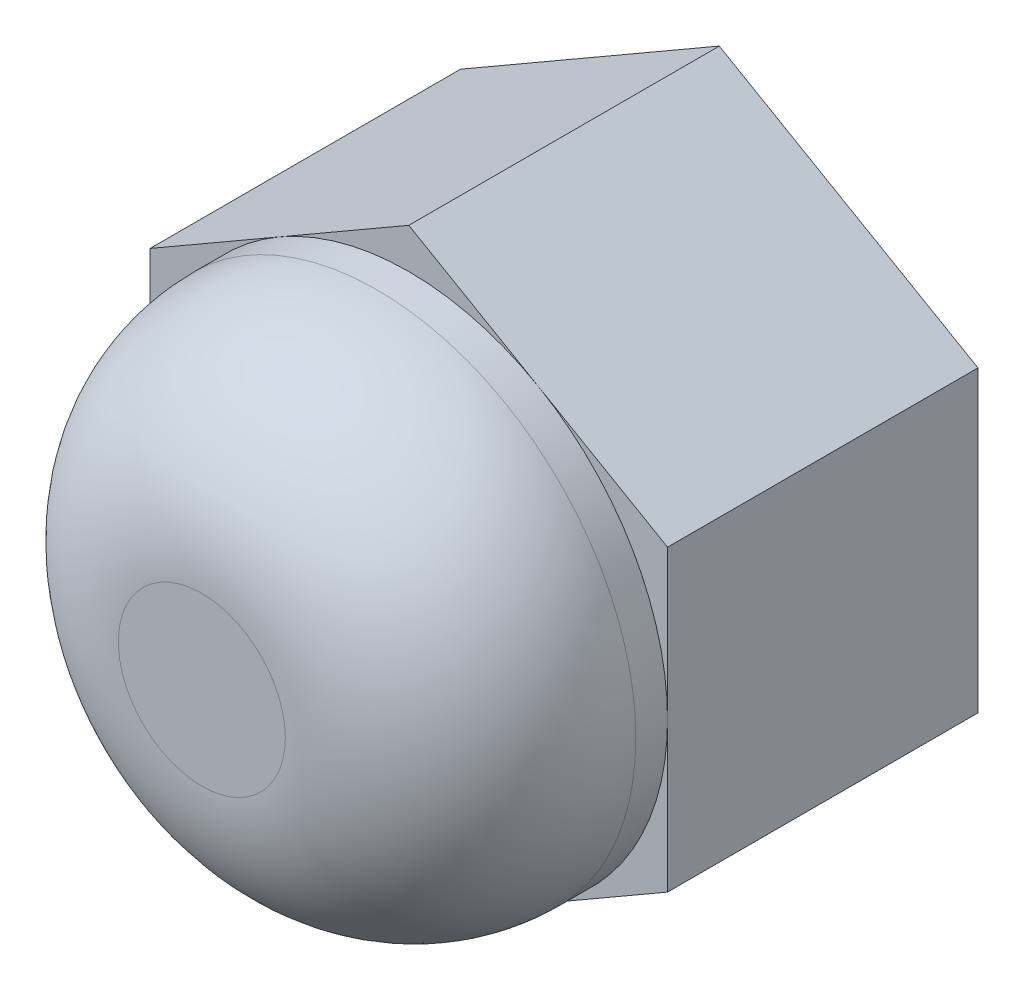
ISO-10303-21;
HEADER;
FILE_DESCRIPTION(('STEP AP214'),'2;1');
FILE_NAME('part.step','',(''),(''),'','','');
FILE_SCHEMA(('AUTOMOTIVE_DESIGN { 1 0 10303 214 1 1 1 1 }'));
ENDSEC;
DATA;
#1=APPLICATION_CONTEXT('core data for automotive mechanical design processes');
#2=APPLICATION_PROTOCOL_DEFINITION('international standard','automotive_design',2000,#1);
#3=PRODUCT_CONTEXT('',#1,'mechanical');
#4=PRODUCT('Part','Part','',(#3));
#5=PRODUCT_RELATED_PRODUCT_CATEGORY('part','',(#4));
#6=PRODUCT_DEFINITION_FORMATION('','',#4);
#7=PRODUCT_DEFINITION_CONTEXT('part definition',#1,'design');
#8=PRODUCT_DEFINITION('design','',#6,#7);
#9=PRODUCT_DEFINITION_SHAPE('','',#8);
#10=(LENGTH_UNIT() NAMED_UNIT(*) SI_UNIT(.MILLI.,.METRE.));
#11=(NAMED_UNIT(*) PLANE_ANGLE_UNIT() SI_UNIT($,.RADIAN.));
#12=(NAMED_UNIT(*) SI_UNIT($,.STERADIAN.) SOLID_ANGLE_UNIT());
#13=UNCERTAINTY_MEASURE_WITH_UNIT(LENGTH_MEASURE(1.E-05),#10,'distance_accuracy_value','');
#14=(GEOMETRIC_REPRESENTATION_CONTEXT(3) GLOBAL_UNCERTAINTY_ASSIGNED_CONTEXT((#13)) GLOBAL_UNIT_ASSIGNED_CONTEXT((#10,
#11,#12)) REPRESENTATION_CONTEXT('',''));
#15=CARTESIAN_POINT('',(0.,0.,0.));
#16=DIRECTION('',(0.,0.,1.));
#17=DIRECTION('',(1.,0.,0.));
#18=AXIS2_PLACEMENT_3D('',#15,#16,#17);
#19=CARTESIAN_POINT('',(0.,0.,9.));
#20=DIRECTION('',(0.,0.,1.));
#21=DIRECTION('',(1.,0.,0.));
#22=AXIS2_PLACEMENT_3D('',#19,#20,#21);
#23=PLANE('',#22);
#24=CARTESIAN_POINT('',(0.,0.,9.));
#25=DIRECTION('',(0.,0.,1.));
#26=DIRECTION('',(1.,0.,0.));
#27=AXIS2_PLACEMENT_3D('',#24,#25,#26);
#28=CIRCLE('',#27,7.5);
#29=CARTESIAN_POINT('',(7.5,0.,9.));
#30=VERTEX_POINT('',#29);
#31=CARTESIAN_POINT('',(3.75,6.49519052838329,9.));
#32=VERTEX_POINT('',#31);
#33=EDGE_CURVE('E145',#30,#32,#28,.T.);
#34=ORIENTED_EDGE('',*,*,#33,.F.);
#35=DIRECTION('',(0.,1.,0.));
#36=VECTOR('',#35,1.);
#37=CARTESIAN_POINT('',(7.5,0.,9.));
#38=LINE('',#37,#36);
#39=CARTESIAN_POINT('',(7.50000000000001,4.33012701892219,9.));
#40=VERTEX_POINT('',#39);
#41=EDGE_CURVE('E132',#30,#40,#38,.T.);
#42=ORIENTED_EDGE('',*,*,#41,.T.);
#43=DIRECTION('',(-0.866025403784439,0.5,0.));
#44=VECTOR('',#43,1.);
#45=CARTESIAN_POINT('',(3.75,6.49519052838329,9.));
#46=LINE('',#45,#44);
#47=EDGE_CURVE('E146',#40,#32,#46,.T.);
#48=ORIENTED_EDGE('',*,*,#47,.T.);
#49=EDGE_LOOP('',(#34,#42,#48));
#50=FACE_BOUND('',#49,.T.);
#51=ADVANCED_FACE('F47',(#50),#23,.T.);
#52=CARTESIAN_POINT('',(-3.75,6.49519052838329,9.));
#53=VERTEX_POINT('',#52);
#54=EDGE_CURVE('E152',#32,#53,#28,.T.);
#55=ORIENTED_EDGE('',*,*,#54,.F.);
#56=CARTESIAN_POINT('',(0.,8.66025403784439,9.));
#57=VERTEX_POINT('',#56);
#58=EDGE_CURVE('E131',#32,#57,#46,.T.);
#59=ORIENTED_EDGE('',*,*,#58,.T.);
#60=DIRECTION('',(-0.866025403784439,-0.5,0.));
#61=VECTOR('',#60,1.);
#62=CARTESIAN_POINT('',(-3.75,6.49519052838329,9.));
#63=LINE('',#62,#61);
#64=EDGE_CURVE('E174',#57,#53,#63,.T.);
#65=ORIENTED_EDGE('',*,*,#64,.T.);
#66=EDGE_LOOP('',(#55,#59,#65));
#67=FACE_BOUND('',#66,.T.);
#68=ADVANCED_FACE('F245',(#67),#23,.T.);
#69=CARTESIAN_POINT('',(-7.5,0.,9.));
#70=VERTEX_POINT('',#69);
#71=EDGE_CURVE('E71',#53,#70,#28,.T.);
#72=ORIENTED_EDGE('',*,*,#71,.F.);
#73=CARTESIAN_POINT('',(-7.5,4.33012701892219,9.));
#74=VERTEX_POINT('',#73);
#75=EDGE_CURVE('E173',#53,#74,#63,.T.);
#76=ORIENTED_EDGE('',*,*,#75,.T.);
#77=DIRECTION('',(0.,-1.,0.));
#78=VECTOR('',#77,1.);
#79=CARTESIAN_POINT('',(-7.5,0.,9.));
#80=LINE('',#79,#78);
#81=EDGE_CURVE('E179',#74,#70,#80,.T.);
#82=ORIENTED_EDGE('',*,*,#81,.T.);
#83=EDGE_LOOP('',(#72,#76,#82));
#84=FACE_BOUND('',#83,.T.);
#85=ADVANCED_FACE('F250',(#84),#23,.T.);
#86=CARTESIAN_POINT('',(-3.75,-6.49519052838329,9.));
#87=VERTEX_POINT('',#86);
#88=EDGE_CURVE('E63',#70,#87,#28,.T.);
#89=ORIENTED_EDGE('',*,*,#88,.F.);
#90=CARTESIAN_POINT('',(-7.50000000000001,-4.33012701892219,9.));
#91=VERTEX_POINT('',#90);
#92=EDGE_CURVE('E178',#70,#91,#80,.T.);
#93=ORIENTED_EDGE('',*,*,#92,.T.);
#94=DIRECTION('',(0.866025403784438,-0.5,0.));
#95=VECTOR('',#94,1.);
#96=CARTESIAN_POINT('',(-3.75,-6.49519052838329,9.));
#97=LINE('',#96,#95);
#98=EDGE_CURVE('E164',#91,#87,#97,.T.);
#99=ORIENTED_EDGE('',*,*,#98,.T.);
#100=EDGE_LOOP('',(#89,#93,#99));
#101=FACE_BOUND('',#100,.T.);
#102=ADVANCED_FACE('F268',(#101),#23,.T.);
#103=CARTESIAN_POINT('',(3.75,-6.49519052838329,9.));
#104=VERTEX_POINT('',#103);
#105=EDGE_CURVE('E155',#87,#104,#28,.T.);
#106=ORIENTED_EDGE('',*,*,#105,.F.);
#107=CARTESIAN_POINT('',(0.,-8.66025403784439,9.));
#108=VERTEX_POINT('',#107);
#109=EDGE_CURVE('E167',#87,#108,#97,.T.);
#110=ORIENTED_EDGE('',*,*,#109,.T.);
#111=DIRECTION('',(0.866025403784439,0.5,0.));
#112=VECTOR('',#111,1.);
#113=CARTESIAN_POINT('',(3.75,-6.49519052838329,9.));
#114=LINE('',#113,#112);
#115=EDGE_CURVE('E143',#108,#104,#114,.T.);
#116=ORIENTED_EDGE('',*,*,#115,.T.);
#117=EDGE_LOOP('',(#106,#110,#116));
#118=FACE_BOUND('',#117,.T.);
#119=ADVANCED_FACE('F256',(#118),#23,.T.);
#120=CARTESIAN_POINT('',(-3.75,-6.49519052838329,9.));
#121=DIRECTION('',(0.5,0.866025403784438,0.));
#122=DIRECTION('',(-0.866025403784439,0.5,0.));
#123=AXIS2_PLACEMENT_3D('',#120,#121,#122);
#124=PLANE('',#123);
#125=DIRECTION('',(0.866025403784438,-0.5,0.));
#126=VECTOR('',#125,1.);
#127=CARTESIAN_POINT('',(-3.75,-6.49519052838329,0.));
#128=LINE('',#127,#126);
#129=CARTESIAN_POINT('',(-7.50000000000001,-4.33012701892219,0.));
#130=VERTEX_POINT('',#129);
#131=CARTESIAN_POINT('',(0.,-8.66025403784439,0.));
#132=VERTEX_POINT('',#131);
#133=EDGE_CURVE('E186',#130,#132,#128,.T.);
#134=ORIENTED_EDGE('',*,*,#133,.T.);
#135=DIRECTION('',(0.,0.,-1.));
#136=VECTOR('',#135,1.);
#137=CARTESIAN_POINT('',(0.,-8.66025403784439,9.));
#138=LINE('',#137,#136);
#139=EDGE_CURVE('E157',#108,#132,#138,.T.);
#140=ORIENTED_EDGE('',*,*,#139,.F.);
#141=ORIENTED_EDGE('',*,*,#109,.F.);
#142=ORIENTED_EDGE('',*,*,#98,.F.);
#143=DIRECTION('',(0.,0.,-1.));
#144=VECTOR('',#143,1.);
#145=CARTESIAN_POINT('',(-7.50000000000001,-4.33012701892219,9.));
#146=LINE('',#145,#144);
#147=EDGE_CURVE('E182',#91,#130,#146,.T.);
#148=ORIENTED_EDGE('',*,*,#147,.T.);
#149=EDGE_LOOP('',(#134,#140,#141,#142,#148));
#150=FACE_BOUND('',#149,.T.);
#151=ADVANCED_FACE('F267',(#150),#124,.F.);
#152=CARTESIAN_POINT('',(3.75,-6.49519052838329,9.));
#153=DIRECTION('',(-0.5,0.866025403784439,0.));
#154=DIRECTION('',(-0.866025403784439,-0.5,0.));
#155=AXIS2_PLACEMENT_3D('',#152,#153,#154);
#156=PLANE('',#155);
#157=DIRECTION('',(0.866025403784439,0.5,0.));
#158=VECTOR('',#157,1.);
#159=CARTESIAN_POINT('',(3.75,-6.49519052838329,0.));
#160=LINE('',#159,#158);
#161=CARTESIAN_POINT('',(7.5,-4.3301270189222,0.));
#162=VERTEX_POINT('',#161);
#163=EDGE_CURVE('E190',#132,#162,#160,.T.);
#164=ORIENTED_EDGE('',*,*,#163,.T.);
#165=DIRECTION('',(0.,0.,-1.));
#166=VECTOR('',#165,1.);
#167=CARTESIAN_POINT('',(7.5,-4.3301270189222,9.));
#168=LINE('',#167,#166);
#169=CARTESIAN_POINT('',(7.5,-4.3301270189222,9.));
#170=VERTEX_POINT('',#169);
#171=EDGE_CURVE('E161',#170,#162,#168,.T.);
#172=ORIENTED_EDGE('',*,*,#171,.F.);
#173=EDGE_CURVE('E126',#104,#170,#114,.T.);
#174=ORIENTED_EDGE('',*,*,#173,.F.);
#175=ORIENTED_EDGE('',*,*,#115,.F.);
#176=ORIENTED_EDGE('',*,*,#139,.T.);
#177=EDGE_LOOP('',(#164,#172,#174,#175,#176));
#178=FACE_BOUND('',#177,.T.);
#179=ADVANCED_FACE('F274',(#178),#156,.F.);
#180=CARTESIAN_POINT('',(7.5,0.,9.));
#181=DIRECTION('',(-1.,0.,0.));
#182=DIRECTION('',(0.,-1.,0.));
#183=AXIS2_PLACEMENT_3D('',#180,#181,#182);
#184=PLANE('',#183);
#185=DIRECTION('',(0.,1.,0.));
#186=VECTOR('',#185,1.);
#187=CARTESIAN_POINT('',(7.5,0.,0.));
#188=LINE('',#187,#186);
#189=CARTESIAN_POINT('',(7.50000000000001,4.33012701892219,0.));
#190=VERTEX_POINT('',#189);
#191=EDGE_CURVE('E193',#162,#190,#188,.T.);
#192=ORIENTED_EDGE('',*,*,#191,.T.);
#193=DIRECTION('',(0.,0.,-1.));
#194=VECTOR('',#193,1.);
#195=CARTESIAN_POINT('',(7.50000000000001,4.33012701892219,9.));
#196=LINE('',#195,#194);
#197=EDGE_CURVE('E138',#40,#190,#196,.T.);
#198=ORIENTED_EDGE('',*,*,#197,.F.);
#199=ORIENTED_EDGE('',*,*,#41,.F.);
#200=EDGE_CURVE('E120',#170,#30,#38,.T.);
#201=ORIENTED_EDGE('',*,*,#200,.F.);
#202=ORIENTED_EDGE('',*,*,#171,.T.);
#203=EDGE_LOOP('',(#192,#198,#199,#201,#202));
#204=FACE_BOUND('',#203,.T.);
#205=ADVANCED_FACE('F136',(#204),#184,.F.);
#206=CARTESIAN_POINT('',(3.75,6.49519052838329,9.));
#207=DIRECTION('',(-0.5,-0.866025403784439,0.));
#208=DIRECTION('',(0.866025403784439,-0.5,0.));
#209=AXIS2_PLACEMENT_3D('',#206,#207,#208);
#210=PLANE('',#209);
#211=DIRECTION('',(-0.866025403784439,0.5,0.));
#212=VECTOR('',#211,1.);
#213=CARTESIAN_POINT('',(3.75,6.49519052838329,0.));
#214=LINE('',#213,#212);
#215=CARTESIAN_POINT('',(0.,8.66025403784439,0.));
#216=VERTEX_POINT('',#215);
#217=EDGE_CURVE('E196',#190,#216,#214,.T.);
#218=ORIENTED_EDGE('',*,*,#217,.T.);
#219=DIRECTION('',(0.,0.,-1.));
#220=VECTOR('',#219,1.);
#221=CARTESIAN_POINT('',(0.,8.66025403784439,9.));
#222=LINE('',#221,#220);
#223=EDGE_CURVE('E212',#57,#216,#222,.T.);
#224=ORIENTED_EDGE('',*,*,#223,.F.);
#225=ORIENTED_EDGE('',*,*,#58,.F.);
#226=ORIENTED_EDGE('',*,*,#47,.F.);
#227=ORIENTED_EDGE('',*,*,#197,.T.);
#228=EDGE_LOOP('',(#218,#224,#225,#226,#227));
#229=FACE_BOUND('',#228,.T.);
#230=ADVANCED_FACE('F290',(#229),#210,.F.);
#231=CARTESIAN_POINT('',(-3.75,6.49519052838329,9.));
#232=DIRECTION('',(0.5,-0.866025403784439,0.));
#233=DIRECTION('',(0.866025403784439,0.5,0.));
#234=AXIS2_PLACEMENT_3D('',#231,#232,#233);
#235=PLANE('',#234);
#236=DIRECTION('',(-0.866025403784439,-0.5,0.));
#237=VECTOR('',#236,1.);
#238=CARTESIAN_POINT('',(-3.75,6.49519052838329,0.));
#239=LINE('',#238,#237);
#240=CARTESIAN_POINT('',(-7.5,4.33012701892219,0.));
#241=VERTEX_POINT('',#240);
#242=EDGE_CURVE('E199',#216,#241,#239,.T.);
#243=ORIENTED_EDGE('',*,*,#242,.T.);
#244=DIRECTION('',(0.,0.,-1.));
#245=VECTOR('',#244,1.);
#246=CARTESIAN_POINT('',(-7.5,4.33012701892219,9.));
#247=LINE('',#246,#245);
#248=EDGE_CURVE('E208',#74,#241,#247,.T.);
#249=ORIENTED_EDGE('',*,*,#248,.F.);
#250=ORIENTED_EDGE('',*,*,#75,.F.);
#251=ORIENTED_EDGE('',*,*,#64,.F.);
#252=ORIENTED_EDGE('',*,*,#223,.T.);
#253=EDGE_LOOP('',(#243,#249,#250,#251,#252));
#254=FACE_BOUND('',#253,.T.);
#255=ADVANCED_FACE('F298',(#254),#235,.F.);
#256=CARTESIAN_POINT('',(-7.5,0.,9.));
#257=DIRECTION('',(1.,0.,0.));
#258=DIRECTION('',(0.,1.,0.));
#259=AXIS2_PLACEMENT_3D('',#256,#257,#258);
#260=PLANE('',#259);
#261=DIRECTION('',(0.,-1.,0.));
#262=VECTOR('',#261,1.);
#263=CARTESIAN_POINT('',(-7.5,0.,0.));
#264=LINE('',#263,#262);
#265=EDGE_CURVE('E202',#241,#130,#264,.T.);
#266=ORIENTED_EDGE('',*,*,#265,.T.);
#267=ORIENTED_EDGE('',*,*,#147,.F.);
#268=ORIENTED_EDGE('',*,*,#92,.F.);
#269=ORIENTED_EDGE('',*,*,#81,.F.);
#270=ORIENTED_EDGE('',*,*,#248,.T.);
#271=EDGE_LOOP('',(#266,#267,#268,#269,#270));
#272=FACE_BOUND('',#271,.T.);
#273=ADVANCED_FACE('F263',(#272),#260,.F.);
#274=CARTESIAN_POINT('',(0.,0.,9.));
#275=DIRECTION('',(0.,0.,-1.));
#276=DIRECTION('',(-1.,0.,0.));
#277=AXIS2_PLACEMENT_3D('',#274,#275,#276);
#278=CYLINDRICAL_SURFACE('',#277,3.9);
#279=CARTESIAN_POINT('',(0.,0.,0.254000000000001));
#280=DIRECTION('',(0.,0.,1.));
#281=DIRECTION('',(1.,0.,0.));
#282=AXIS2_PLACEMENT_3D('',#279,#280,#281);
#283=CIRCLE('',#282,3.9);
#284=CARTESIAN_POINT('',(3.9,0.,0.254000000000001));
#285=VERTEX_POINT('',#284);
#286=EDGE_CURVE('E11',#285,#285,#283,.F.);
#287=ORIENTED_EDGE('',*,*,#286,.T.);
#288=EDGE_LOOP('',(#287));
#289=FACE_BOUND('',#288,.T.);
#290=CARTESIAN_POINT('',(0.,0.,9.));
#291=DIRECTION('',(0.,0.,1.));
#292=DIRECTION('',(1.,0.,0.));
#293=AXIS2_PLACEMENT_3D('',#290,#291,#292);
#294=CIRCLE('',#293,3.9);
#295=CARTESIAN_POINT('',(3.9,0.,9.));
#296=VERTEX_POINT('',#295);
#297=EDGE_CURVE('E150',#296,#296,#294,.T.);
#298=ORIENTED_EDGE('',*,*,#297,.T.);
#299=EDGE_LOOP('',(#298));
#300=FACE_BOUND('',#299,.T.);
#301=ADVANCED_FACE('F255',(#289,#300),#278,.F.);
#302=EDGE_CURVE('E124',#104,#30,#28,.T.);
#303=ORIENTED_EDGE('',*,*,#302,.F.);
#304=ORIENTED_EDGE('',*,*,#173,.T.);
#305=ORIENTED_EDGE('',*,*,#200,.T.);
#306=EDGE_LOOP('',(#303,#304,#305));
#307=FACE_BOUND('',#306,.T.);
#308=ADVANCED_FACE('F122',(#307),#23,.T.);
#309=CARTESIAN_POINT('',(0.,0.,0.));
#310=DIRECTION('',(0.,0.,1.));
#311=DIRECTION('',(1.,0.,0.));
#312=AXIS2_PLACEMENT_3D('',#309,#310,#311);
#313=PLANE('',#312);
#314=CARTESIAN_POINT('',(0.,0.,0.));
#315=DIRECTION('',(0.,0.,1.));
#316=DIRECTION('',(1.,0.,0.));
#317=AXIS2_PLACEMENT_3D('',#314,#315,#316);
#318=CIRCLE('',#317,4.154);
#319=CARTESIAN_POINT('',(4.154,0.,0.));
#320=VERTEX_POINT('',#319);
#321=EDGE_CURVE('E56',#320,#320,#318,.T.);
#322=ORIENTED_EDGE('',*,*,#321,.T.);
#323=EDGE_LOOP('',(#322));
#324=FACE_BOUND('',#323,.T.);
#325=ORIENTED_EDGE('',*,*,#133,.F.);
#326=ORIENTED_EDGE('',*,*,#265,.F.);
#327=ORIENTED_EDGE('',*,*,#242,.F.);
#328=ORIENTED_EDGE('',*,*,#217,.F.);
#329=ORIENTED_EDGE('',*,*,#191,.F.);
#330=ORIENTED_EDGE('',*,*,#163,.F.);
#331=EDGE_LOOP('',(#325,#326,#327,#328,#329,#330));
#332=FACE_BOUND('',#331,.T.);
#333=ADVANCED_FACE('F231',(#324,#332),#313,.F.);
#334=CARTESIAN_POINT('',(0.,0.,15.));
#335=DIRECTION('',(0.,0.,1.));
#336=DIRECTION('',(1.,0.,0.));
#337=AXIS2_PLACEMENT_3D('',#334,#335,#336);
#338=PLANE('',#337);
#339=CARTESIAN_POINT('',(0.,0.,15.));
#340=DIRECTION('',(0.,0.,1.));
#341=DIRECTION('',(1.,0.,0.));
#342=AXIS2_PLACEMENT_3D('',#339,#340,#341);
#343=CIRCLE('',#342,2.42);
#344=CARTESIAN_POINT('',(2.42,0.,15.));
#345=VERTEX_POINT('',#344);
#346=EDGE_CURVE('E220',#345,#345,#343,.T.);
#347=ORIENTED_EDGE('',*,*,#346,.T.);
#348=EDGE_LOOP('',(#347));
#349=FACE_BOUND('',#348,.T.);
#350=ADVANCED_FACE('F261',(#349),#338,.T.);
#351=CARTESIAN_POINT('',(0.,0.,15.));
#352=DIRECTION('',(0.,0.,-1.));
#353=DIRECTION('',(-1.,0.,0.));
#354=AXIS2_PLACEMENT_3D('',#351,#352,#353);
#355=CYLINDRICAL_SURFACE('',#354,7.5);
#356=CARTESIAN_POINT('',(0.,0.,9.92));
#357=DIRECTION('',(0.,0.,1.));
#358=DIRECTION('',(1.,0.,0.));
#359=AXIS2_PLACEMENT_3D('',#356,#357,#358);
#360=CIRCLE('',#359,7.5);
#361=CARTESIAN_POINT('',(7.5,0.,9.92));
#362=VERTEX_POINT('',#361);
#363=EDGE_CURVE('E224',#362,#362,#360,.F.);
#364=ORIENTED_EDGE('',*,*,#363,.T.);
#365=EDGE_LOOP('',(#364));
#366=FACE_BOUND('',#365,.T.);
#367=ORIENTED_EDGE('',*,*,#33,.T.);
#368=ORIENTED_EDGE('',*,*,#54,.T.);
#369=ORIENTED_EDGE('',*,*,#71,.T.);
#370=ORIENTED_EDGE('',*,*,#88,.T.);
#371=ORIENTED_EDGE('',*,*,#105,.T.);
#372=ORIENTED_EDGE('',*,*,#302,.T.);
#373=EDGE_LOOP('',(#367,#368,#369,#370,#371,#372));
#374=FACE_BOUND('',#373,.T.);
#375=ADVANCED_FACE('F154',(#366,#374),#355,.T.);
#376=CARTESIAN_POINT('',(0.,0.,9.));
#377=DIRECTION('',(0.,0.,1.));
#378=DIRECTION('',(1.,0.,0.));
#379=AXIS2_PLACEMENT_3D('',#376,#377,#378);
#380=PLANE('',#379);
#381=ORIENTED_EDGE('',*,*,#297,.F.);
#382=EDGE_LOOP('',(#381));
#383=FACE_BOUND('',#382,.T.);
#384=ADVANCED_FACE('F241',(#383),#380,.F.);
#385=CARTESIAN_POINT('',(0.,0.,9.92));
#386=DIRECTION('',(0.,0.,1.));
#387=DIRECTION('',(1.,0.,0.));
#388=AXIS2_PLACEMENT_3D('',#385,#386,#387);
#389=DEGENERATE_TOROIDAL_SURFACE('',#388,2.42,5.08,.T.);
#390=ORIENTED_EDGE('',*,*,#363,.F.);
#391=EDGE_LOOP('',(#390));
#392=FACE_BOUND('',#391,.T.);
#393=ORIENTED_EDGE('',*,*,#346,.F.);
#394=EDGE_LOOP('',(#393));
#395=FACE_BOUND('',#394,.T.);
#396=ADVANCED_FACE('F235',(#392,#395),#389,.T.);
#397=CARTESIAN_POINT('',(0.,0.,0.254000000000001));
#398=DIRECTION('',(0.,0.,1.));
#399=DIRECTION('',(1.,0.,0.));
#400=AXIS2_PLACEMENT_3D('',#397,#398,#399);
#401=TOROIDAL_SURFACE('',#400,4.154,0.254);
#402=ORIENTED_EDGE('',*,*,#286,.F.);
#403=EDGE_LOOP('',(#402));
#404=FACE_BOUND('',#403,.T.);
#405=ORIENTED_EDGE('',*,*,#321,.F.);
#406=EDGE_LOOP('',(#405));
#407=FACE_BOUND('',#406,.T.);
#408=ADVANCED_FACE('F49',(#404,#407),#401,.T.);
#409=CLOSED_SHELL('',(#51,#68,#85,#102,#119,#151,#179,#205,#230,#255,#273,#301,#308,#333,#350,
#375,#384,#396,#408));
#410=MANIFOLD_SOLID_BREP('B2',#409);
#411=ADVANCED_BREP_SHAPE_REPRESENTATION('',(#18,#410),#14);
#412=SHAPE_DEFINITION_REPRESENTATION(#9,#411);
ENDSEC;
END-ISO-10303-21;
